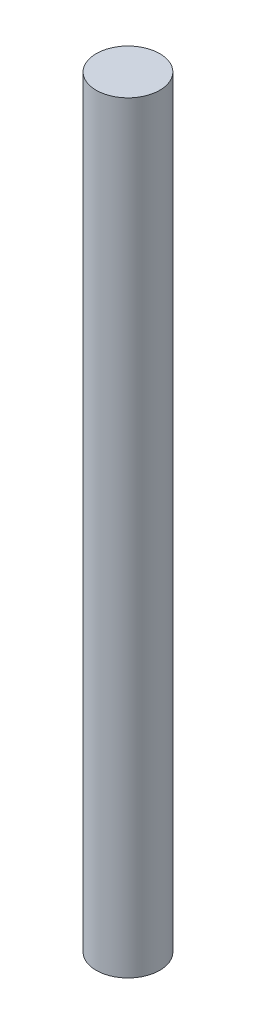
ISO-10303-21;
HEADER;
FILE_DESCRIPTION(('STEP AP214'),'2;1');
FILE_NAME('part.step','',(''),(''),'','','');
FILE_SCHEMA(('AUTOMOTIVE_DESIGN { 1 0 10303 214 1 1 1 1 }'));
ENDSEC;
DATA;
#1=APPLICATION_CONTEXT('core data for automotive mechanical design processes');
#2=APPLICATION_PROTOCOL_DEFINITION('international standard','automotive_design',2000,#1);
#3=PRODUCT_CONTEXT('',#1,'mechanical');
#4=PRODUCT('Part','Part','',(#3));
#5=PRODUCT_RELATED_PRODUCT_CATEGORY('part','',(#4));
#6=PRODUCT_DEFINITION_FORMATION('','',#4);
#7=PRODUCT_DEFINITION_CONTEXT('part definition',#1,'design');
#8=PRODUCT_DEFINITION('design','',#6,#7);
#9=PRODUCT_DEFINITION_SHAPE('','',#8);
#10=(LENGTH_UNIT() NAMED_UNIT(*) SI_UNIT(.MILLI.,.METRE.));
#11=(NAMED_UNIT(*) PLANE_ANGLE_UNIT() SI_UNIT($,.RADIAN.));
#12=(NAMED_UNIT(*) SI_UNIT($,.STERADIAN.) SOLID_ANGLE_UNIT());
#13=UNCERTAINTY_MEASURE_WITH_UNIT(LENGTH_MEASURE(1.E-05),#10,'distance_accuracy_value','');
#14=(GEOMETRIC_REPRESENTATION_CONTEXT(3) GLOBAL_UNCERTAINTY_ASSIGNED_CONTEXT((#13)) GLOBAL_UNIT_ASSIGNED_CONTEXT((#10,
#11,#12)) REPRESENTATION_CONTEXT('',''));
#15=CARTESIAN_POINT('',(0.,0.,0.));
#16=DIRECTION('',(0.,0.,1.));
#17=DIRECTION('',(1.,0.,0.));
#18=AXIS2_PLACEMENT_3D('',#15,#16,#17);
#19=CARTESIAN_POINT('',(0.,60.,0.));
#20=DIRECTION('',(0.,-1.,0.));
#21=DIRECTION('',(0.,0.,-1.));
#22=AXIS2_PLACEMENT_3D('',#19,#20,#21);
#23=CYLINDRICAL_SURFACE('',#22,2.5);
#24=CARTESIAN_POINT('',(0.,60.,0.));
#25=DIRECTION('',(0.,1.,0.));
#26=DIRECTION('',(0.,0.,1.));
#27=AXIS2_PLACEMENT_3D('',#24,#25,#26);
#28=CIRCLE('',#27,2.5);
#29=CARTESIAN_POINT('',(0.,60.,2.5));
#30=VERTEX_POINT('',#29);
#31=EDGE_CURVE('E10',#30,#30,#28,.T.);
#32=ORIENTED_EDGE('',*,*,#31,.F.);
#33=EDGE_LOOP('',(#32));
#34=FACE_BOUND('',#33,.T.);
#35=CARTESIAN_POINT('',(0.,0.,0.));
#36=DIRECTION('',(0.,1.,0.));
#37=DIRECTION('',(0.,0.,1.));
#38=AXIS2_PLACEMENT_3D('',#35,#36,#37);
#39=CIRCLE('',#38,2.5);
#40=CARTESIAN_POINT('',(0.,0.,2.5));
#41=VERTEX_POINT('',#40);
#42=EDGE_CURVE('E39',#41,#41,#39,.T.);
#43=ORIENTED_EDGE('',*,*,#42,.T.);
#44=EDGE_LOOP('',(#43));
#45=FACE_BOUND('',#44,.T.);
#46=ADVANCED_FACE('F36',(#34,#45),#23,.T.);
#47=CARTESIAN_POINT('',(0.,60.,0.));
#48=DIRECTION('',(0.,1.,0.));
#49=DIRECTION('',(0.,0.,1.));
#50=AXIS2_PLACEMENT_3D('',#47,#48,#49);
#51=PLANE('',#50);
#52=ORIENTED_EDGE('',*,*,#31,.T.);
#53=EDGE_LOOP('',(#52));
#54=FACE_BOUND('',#53,.T.);
#55=ADVANCED_FACE('F51',(#54),#51,.T.);
#56=CARTESIAN_POINT('',(0.,0.,0.));
#57=DIRECTION('',(0.,1.,0.));
#58=DIRECTION('',(0.,0.,1.));
#59=AXIS2_PLACEMENT_3D('',#56,#57,#58);
#60=PLANE('',#59);
#61=ORIENTED_EDGE('',*,*,#42,.F.);
#62=EDGE_LOOP('',(#61));
#63=FACE_BOUND('',#62,.T.);
#64=ADVANCED_FACE('F49',(#63),#60,.F.);
#65=CLOSED_SHELL('',(#46,#55,#64));
#66=MANIFOLD_SOLID_BREP('B2',#65);
#67=ADVANCED_BREP_SHAPE_REPRESENTATION('',(#18,#66),#14);
#68=SHAPE_DEFINITION_REPRESENTATION(#9,#67);
ENDSEC;
END-ISO-10303-21;
